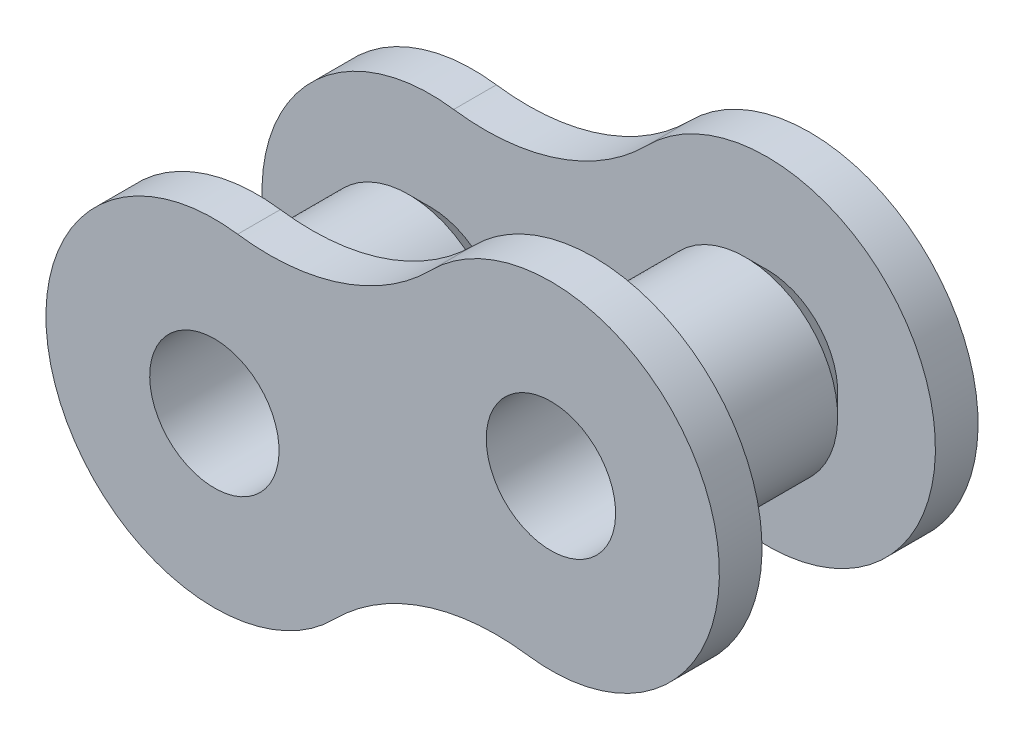
ISO-10303-21;
HEADER;
FILE_DESCRIPTION(('STEP AP214'),'2;1');
FILE_NAME('part.step','',(''),(''),'','','');
FILE_SCHEMA(('AUTOMOTIVE_DESIGN { 1 0 10303 214 1 1 1 1 }'));
ENDSEC;
DATA;
#1=APPLICATION_CONTEXT('core data for automotive mechanical design processes');
#2=APPLICATION_PROTOCOL_DEFINITION('international standard','automotive_design',2000,#1);
#3=PRODUCT_CONTEXT('',#1,'mechanical');
#4=PRODUCT('Part','Part','',(#3));
#5=PRODUCT_RELATED_PRODUCT_CATEGORY('part','',(#4));
#6=PRODUCT_DEFINITION_FORMATION('','',#4);
#7=PRODUCT_DEFINITION_CONTEXT('part definition',#1,'design');
#8=PRODUCT_DEFINITION('design','',#6,#7);
#9=PRODUCT_DEFINITION_SHAPE('','',#8);
#10=(LENGTH_UNIT() NAMED_UNIT(*) SI_UNIT(.MILLI.,.METRE.));
#11=(NAMED_UNIT(*) PLANE_ANGLE_UNIT() SI_UNIT($,.RADIAN.));
#12=(NAMED_UNIT(*) SI_UNIT($,.STERADIAN.) SOLID_ANGLE_UNIT());
#13=UNCERTAINTY_MEASURE_WITH_UNIT(LENGTH_MEASURE(1.E-05),#10,'distance_accuracy_value','');
#14=(GEOMETRIC_REPRESENTATION_CONTEXT(3) GLOBAL_UNCERTAINTY_ASSIGNED_CONTEXT((#13)) GLOBAL_UNIT_ASSIGNED_CONTEXT((#10,
#11,#12)) REPRESENTATION_CONTEXT('',''));
#15=CARTESIAN_POINT('',(0.,0.,0.));
#16=DIRECTION('',(0.,0.,1.));
#17=DIRECTION('',(1.,0.,0.));
#18=AXIS2_PLACEMENT_3D('',#15,#16,#17);
#19=CARTESIAN_POINT('',(99.9414403194544,925.337857612796,-128.5494));
#20=DIRECTION('',(0.,0.,-1.));
#21=DIRECTION('',(0.,-1.,0.));
#22=AXIS2_PLACEMENT_3D('',#19,#20,#21);
#23=PLANE('',#22);
#24=CARTESIAN_POINT('',(96.9343780588444,924.318935848962,-128.5494));
#25=DIRECTION('',(0.,0.,1.));
#26=DIRECTION('',(0.94710622381415,0.320920240577783,0.));
#27=AXIS2_PLACEMENT_3D('',#24,#25,#26);
#28=CIRCLE('',#27,3.0099);
#29=CARTESIAN_POINT('',(97.3505494962816,927.299925507558,-128.5494));
#30=VERTEX_POINT('',#29);
#31=CARTESIAN_POINT('',(99.0769437949649,922.204956171575,-128.5494));
#32=VERTEX_POINT('',#31);
#33=EDGE_CURVE('E230',#30,#32,#28,.T.);
#34=ORIENTED_EDGE('',*,*,#33,.T.);
#35=CARTESIAN_POINT('',(101.970322064774,919.350181282641,-128.5494));
#36=DIRECTION('',(0.,0.,1.));
#37=DIRECTION('',(0.94710622381415,0.320920240577783,0.));
#38=AXIS2_PLACEMENT_3D('',#35,#36,#37);
#39=CIRCLE('',#38,4.06464973628698);
#40=CARTESIAN_POINT('',(102.532331142627,923.375789718034,-128.5494));
#41=VERTEX_POINT('',#40);
#42=EDGE_CURVE('E203',#41,#32,#39,.T.);
#43=ORIENTED_EDGE('',*,*,#42,.F.);
#44=CARTESIAN_POINT('',(102.948502580064,926.356779376631,-128.5494));
#45=DIRECTION('',(0.,0.,1.));
#46=DIRECTION('',(0.94710622381415,0.320920240577783,0.));
#47=AXIS2_PLACEMENT_3D('',#44,#45,#46);
#48=CIRCLE('',#47,3.0099);
#49=CARTESIAN_POINT('',(100.805936843944,928.470759054017,-128.5494));
#50=VERTEX_POINT('',#49);
#51=EDGE_CURVE('E242',#41,#50,#48,.T.);
#52=ORIENTED_EDGE('',*,*,#51,.T.);
#53=CARTESIAN_POINT('',(97.9125585741344,931.325533942952,-128.5494));
#54=DIRECTION('',(0.,0.,1.));
#55=DIRECTION('',(0.94710622381415,0.320920240577783,0.));
#56=AXIS2_PLACEMENT_3D('',#53,#54,#55);
#57=CIRCLE('',#56,4.06464973628691);
#58=EDGE_CURVE('E20',#30,#50,#57,.T.);
#59=ORIENTED_EDGE('',*,*,#58,.F.);
#60=EDGE_LOOP('',(#34,#43,#52,#59));
#61=FACE_BOUND('',#60,.T.);
#62=CARTESIAN_POINT('',(102.948502580064,926.356779376631,-128.5494));
#63=DIRECTION('',(0.,0.,1.));
#64=DIRECTION('',(0.94710622381415,0.320920240577783,0.));
#65=AXIS2_PLACEMENT_3D('',#62,#63,#64);
#66=CIRCLE('',#65,1.26365);
#67=CARTESIAN_POINT('',(104.145313359787,926.762310238637,-128.5494));
#68=VERTEX_POINT('',#67);
#69=EDGE_CURVE('E227',#68,#68,#66,.T.);
#70=ORIENTED_EDGE('',*,*,#69,.F.);
#71=EDGE_LOOP('',(#70));
#72=FACE_BOUND('',#71,.T.);
#73=CARTESIAN_POINT('',(96.9343780588444,924.318935848962,-128.5494));
#74=DIRECTION('',(0.,0.,1.));
#75=DIRECTION('',(0.94710622381415,0.320920240577783,0.));
#76=AXIS2_PLACEMENT_3D('',#73,#74,#75);
#77=CIRCLE('',#76,1.26365);
#78=CARTESIAN_POINT('',(98.1311888385672,924.724466710968,-128.5494));
#79=VERTEX_POINT('',#78);
#80=EDGE_CURVE('E224',#79,#79,#77,.T.);
#81=ORIENTED_EDGE('',*,*,#80,.F.);
#82=EDGE_LOOP('',(#81));
#83=FACE_BOUND('',#82,.T.);
#84=ADVANCED_FACE('F17',(#61,#72,#83),#23,.F.);
#85=CARTESIAN_POINT('',(99.9414403194544,925.337857612796,-129.3114));
#86=DIRECTION('',(0.,0.,-1.));
#87=DIRECTION('',(0.,-1.,0.));
#88=AXIS2_PLACEMENT_3D('',#85,#86,#87);
#89=PLANE('',#88);
#90=CARTESIAN_POINT('',(96.9343780588444,924.318935848962,-129.3114));
#91=DIRECTION('',(0.,0.,1.));
#92=DIRECTION('',(0.94710622381415,0.320920240577783,0.));
#93=AXIS2_PLACEMENT_3D('',#90,#91,#92);
#94=CIRCLE('',#93,1.1557);
#95=CARTESIAN_POINT('',(98.0289487217064,924.689823370998,-129.3114));
#96=VERTEX_POINT('',#95);
#97=EDGE_CURVE('E587',#96,#96,#94,.T.);
#98=ORIENTED_EDGE('',*,*,#97,.T.);
#99=EDGE_LOOP('',(#98));
#100=FACE_BOUND('',#99,.T.);
#101=CARTESIAN_POINT('',(102.948502580064,926.356779376631,-129.3114));
#102=DIRECTION('',(0.,0.,1.));
#103=DIRECTION('',(0.94710622381415,0.320920240577783,0.));
#104=AXIS2_PLACEMENT_3D('',#101,#102,#103);
#105=CIRCLE('',#104,1.1557);
#106=CARTESIAN_POINT('',(104.043073242926,926.727666898667,-129.3114));
#107=VERTEX_POINT('',#106);
#108=EDGE_CURVE('E193',#107,#107,#105,.T.);
#109=ORIENTED_EDGE('',*,*,#108,.T.);
#110=EDGE_LOOP('',(#109));
#111=FACE_BOUND('',#110,.T.);
#112=CARTESIAN_POINT('',(96.9343780588444,924.318935848962,-129.3114));
#113=DIRECTION('',(0.,0.,1.));
#114=DIRECTION('',(0.94710622381415,0.320920240577783,0.));
#115=AXIS2_PLACEMENT_3D('',#112,#113,#114);
#116=CIRCLE('',#115,3.0099);
#117=CARTESIAN_POINT('',(97.3505494962816,927.299925507558,-129.3114));
#118=VERTEX_POINT('',#117);
#119=CARTESIAN_POINT('',(99.0769437949649,922.204956171575,-129.3114));
#120=VERTEX_POINT('',#119);
#121=EDGE_CURVE('E237',#118,#120,#116,.T.);
#122=ORIENTED_EDGE('',*,*,#121,.F.);
#123=CARTESIAN_POINT('',(97.9125585741344,931.325533942952,-129.3114));
#124=DIRECTION('',(0.,0.,1.));
#125=DIRECTION('',(0.94710622381415,0.320920240577783,0.));
#126=AXIS2_PLACEMENT_3D('',#123,#124,#125);
#127=CIRCLE('',#126,4.06464973628691);
#128=CARTESIAN_POINT('',(100.805936843944,928.470759054017,-129.3114));
#129=VERTEX_POINT('',#128);
#130=EDGE_CURVE('E11',#118,#129,#127,.T.);
#131=ORIENTED_EDGE('',*,*,#130,.T.);
#132=CARTESIAN_POINT('',(102.948502580064,926.356779376631,-129.3114));
#133=DIRECTION('',(0.,0.,1.));
#134=DIRECTION('',(0.94710622381415,0.320920240577783,0.));
#135=AXIS2_PLACEMENT_3D('',#132,#133,#134);
#136=CIRCLE('',#135,3.0099);
#137=CARTESIAN_POINT('',(102.532331142627,923.375789718034,-129.3114));
#138=VERTEX_POINT('',#137);
#139=EDGE_CURVE('E254',#138,#129,#136,.T.);
#140=ORIENTED_EDGE('',*,*,#139,.F.);
#141=CARTESIAN_POINT('',(101.970322064774,919.350181282641,-129.3114));
#142=DIRECTION('',(0.,0.,1.));
#143=DIRECTION('',(0.94710622381415,0.320920240577783,0.));
#144=AXIS2_PLACEMENT_3D('',#141,#142,#143);
#145=CIRCLE('',#144,4.06464973628698);
#146=EDGE_CURVE('E205',#138,#120,#145,.T.);
#147=ORIENTED_EDGE('',*,*,#146,.T.);
#148=EDGE_LOOP('',(#122,#131,#140,#147));
#149=FACE_BOUND('',#148,.T.);
#150=ADVANCED_FACE('F426',(#100,#111,#149),#89,.T.);
#151=CARTESIAN_POINT('',(97.9125585741344,931.325533942952,-129.3114));
#152=DIRECTION('',(0.,0.,1.));
#153=DIRECTION('',(-0.94710622381415,-0.320920240577783,0.));
#154=AXIS2_PLACEMENT_3D('',#151,#152,#153);
#155=CYLINDRICAL_SURFACE('',#154,4.06464973628691);
#156=ORIENTED_EDGE('',*,*,#58,.T.);
#157=DIRECTION('',(0.,0.,1.));
#158=VECTOR('',#157,1.);
#159=CARTESIAN_POINT('',(100.805936843944,928.470759054017,-129.3114));
#160=LINE('',#159,#158);
#161=EDGE_CURVE('E257',#129,#50,#160,.T.);
#162=ORIENTED_EDGE('',*,*,#161,.F.);
#163=ORIENTED_EDGE('',*,*,#130,.F.);
#164=DIRECTION('',(0.,0.,1.));
#165=VECTOR('',#164,1.);
#166=CARTESIAN_POINT('',(97.3505494962816,927.299925507558,-129.3114));
#167=LINE('',#166,#165);
#168=EDGE_CURVE('E234',#118,#30,#167,.T.);
#169=ORIENTED_EDGE('',*,*,#168,.T.);
#170=EDGE_LOOP('',(#156,#162,#163,#169));
#171=FACE_BOUND('',#170,.T.);
#172=ADVANCED_FACE('F418',(#171),#155,.F.);
#173=CARTESIAN_POINT('',(102.948502580064,926.356779376631,-129.3114));
#174=DIRECTION('',(0.,0.,1.));
#175=DIRECTION('',(-0.94710622381415,-0.320920240577783,0.));
#176=AXIS2_PLACEMENT_3D('',#173,#174,#175);
#177=CYLINDRICAL_SURFACE('',#176,3.0099);
#178=ORIENTED_EDGE('',*,*,#51,.F.);
#179=DIRECTION('',(0.,0.,1.));
#180=VECTOR('',#179,1.);
#181=CARTESIAN_POINT('',(102.532331142627,923.375789718034,-129.3114));
#182=LINE('',#181,#180);
#183=EDGE_CURVE('E238',#138,#41,#182,.T.);
#184=ORIENTED_EDGE('',*,*,#183,.F.);
#185=ORIENTED_EDGE('',*,*,#139,.T.);
#186=ORIENTED_EDGE('',*,*,#161,.T.);
#187=EDGE_LOOP('',(#178,#184,#185,#186));
#188=FACE_BOUND('',#187,.T.);
#189=ADVANCED_FACE('F352',(#188),#177,.T.);
#190=CARTESIAN_POINT('',(101.970322064774,919.350181282641,-129.3114));
#191=DIRECTION('',(0.,0.,1.));
#192=DIRECTION('',(-0.94710622381415,-0.320920240577783,0.));
#193=AXIS2_PLACEMENT_3D('',#190,#191,#192);
#194=CYLINDRICAL_SURFACE('',#193,4.06464973628698);
#195=ORIENTED_EDGE('',*,*,#42,.T.);
#196=DIRECTION('',(0.,0.,1.));
#197=VECTOR('',#196,1.);
#198=CARTESIAN_POINT('',(99.0769437949649,922.204956171575,-129.3114));
#199=LINE('',#198,#197);
#200=EDGE_CURVE('E206',#120,#32,#199,.T.);
#201=ORIENTED_EDGE('',*,*,#200,.F.);
#202=ORIENTED_EDGE('',*,*,#146,.F.);
#203=ORIENTED_EDGE('',*,*,#183,.T.);
#204=EDGE_LOOP('',(#195,#201,#202,#203));
#205=FACE_BOUND('',#204,.T.);
#206=ADVANCED_FACE('F346',(#205),#194,.F.);
#207=CARTESIAN_POINT('',(96.9343780588444,924.318935848962,-129.3114));
#208=DIRECTION('',(0.,0.,1.));
#209=DIRECTION('',(-0.94710622381415,-0.320920240577783,0.));
#210=AXIS2_PLACEMENT_3D('',#207,#208,#209);
#211=CYLINDRICAL_SURFACE('',#210,3.0099);
#212=ORIENTED_EDGE('',*,*,#33,.F.);
#213=ORIENTED_EDGE('',*,*,#168,.F.);
#214=ORIENTED_EDGE('',*,*,#121,.T.);
#215=ORIENTED_EDGE('',*,*,#200,.T.);
#216=EDGE_LOOP('',(#212,#213,#214,#215));
#217=FACE_BOUND('',#216,.T.);
#218=ADVANCED_FACE('F351',(#217),#211,.T.);
#219=CARTESIAN_POINT('',(102.948502580064,926.356779376631,-128.5494));
#220=DIRECTION('',(0.,0.,1.));
#221=DIRECTION('',(-0.94710622381415,-0.320920240577783,0.));
#222=AXIS2_PLACEMENT_3D('',#219,#220,#221);
#223=CONICAL_SURFACE('',#222,1.26365,0.785398163397448);
#224=ORIENTED_EDGE('',*,*,#69,.T.);
#225=EDGE_LOOP('',(#224));
#226=FACE_BOUND('',#225,.T.);
#227=CARTESIAN_POINT('',(102.948502580064,926.356779376631,-128.16205));
#228=DIRECTION('',(0.,0.,-1.));
#229=DIRECTION('',(0.94710622381415,0.320920240577783,0.));
#230=AXIS2_PLACEMENT_3D('',#227,#228,#229);
#231=CIRCLE('',#230,1.651);
#232=CARTESIAN_POINT('',(104.512174955581,926.886618693825,-128.16205));
#233=VERTEX_POINT('',#232);
#234=EDGE_CURVE('E187',#233,#233,#231,.T.);
#235=ORIENTED_EDGE('',*,*,#234,.T.);
#236=EDGE_LOOP('',(#235));
#237=FACE_BOUND('',#236,.T.);
#238=ADVANCED_FACE('F369',(#226,#237),#223,.T.);
#239=CARTESIAN_POINT('',(96.9343780588444,924.318935848962,-128.5494));
#240=DIRECTION('',(0.,0.,1.));
#241=DIRECTION('',(-0.94710622381415,-0.320920240577783,0.));
#242=AXIS2_PLACEMENT_3D('',#239,#240,#241);
#243=CONICAL_SURFACE('',#242,1.26365,0.785398163397448);
#244=ORIENTED_EDGE('',*,*,#80,.T.);
#245=EDGE_LOOP('',(#244));
#246=FACE_BOUND('',#245,.T.);
#247=CARTESIAN_POINT('',(96.9343780588444,924.318935848962,-128.16205));
#248=DIRECTION('',(0.,0.,-1.));
#249=DIRECTION('',(0.94710622381415,0.320920240577783,0.));
#250=AXIS2_PLACEMENT_3D('',#247,#248,#249);
#251=CIRCLE('',#250,1.651);
#252=CARTESIAN_POINT('',(98.4980504343616,924.848775166156,-128.16205));
#253=VERTEX_POINT('',#252);
#254=EDGE_CURVE('E579',#253,#253,#251,.T.);
#255=ORIENTED_EDGE('',*,*,#254,.T.);
#256=EDGE_LOOP('',(#255));
#257=FACE_BOUND('',#256,.T.);
#258=ADVANCED_FACE('F394',(#246,#257),#243,.T.);
#259=CARTESIAN_POINT('',(99.9414403194544,925.337857612796,-125.4506));
#260=DIRECTION('',(0.,0.,1.));
#261=DIRECTION('',(1.,0.,0.));
#262=AXIS2_PLACEMENT_3D('',#259,#260,#261);
#263=PLANE('',#262);
#264=CARTESIAN_POINT('',(96.9343780588444,924.318935848962,-125.4506));
#265=DIRECTION('',(0.,0.,1.));
#266=DIRECTION('',(0.94710622381415,0.320920240577783,0.));
#267=AXIS2_PLACEMENT_3D('',#264,#265,#266);
#268=CIRCLE('',#267,3.0099);
#269=CARTESIAN_POINT('',(97.3505494962816,927.299925507558,-125.4506));
#270=VERTEX_POINT('',#269);
#271=CARTESIAN_POINT('',(99.0769437949649,922.204956171575,-125.4506));
#272=VERTEX_POINT('',#271);
#273=EDGE_CURVE('E168',#270,#272,#268,.T.);
#274=ORIENTED_EDGE('',*,*,#273,.F.);
#275=CARTESIAN_POINT('',(97.9125585741344,931.325533942952,-125.4506));
#276=DIRECTION('',(0.,0.,1.));
#277=DIRECTION('',(0.94710622381415,0.320920240577783,0.));
#278=AXIS2_PLACEMENT_3D('',#275,#276,#277);
#279=CIRCLE('',#278,4.06464973628691);
#280=CARTESIAN_POINT('',(100.805936843944,928.470759054017,-125.4506));
#281=VERTEX_POINT('',#280);
#282=EDGE_CURVE('E150',#270,#281,#279,.T.);
#283=ORIENTED_EDGE('',*,*,#282,.T.);
#284=CARTESIAN_POINT('',(102.948502580064,926.356779376631,-125.4506));
#285=DIRECTION('',(0.,0.,1.));
#286=DIRECTION('',(0.94710622381415,0.320920240577783,0.));
#287=AXIS2_PLACEMENT_3D('',#284,#285,#286);
#288=CIRCLE('',#287,3.0099);
#289=CARTESIAN_POINT('',(102.532331142627,923.375789718034,-125.4506));
#290=VERTEX_POINT('',#289);
#291=EDGE_CURVE('E197',#290,#281,#288,.T.);
#292=ORIENTED_EDGE('',*,*,#291,.F.);
#293=CARTESIAN_POINT('',(101.970322064774,919.350181282641,-125.4506));
#294=DIRECTION('',(0.,0.,1.));
#295=DIRECTION('',(0.94710622381415,0.320920240577783,0.));
#296=AXIS2_PLACEMENT_3D('',#293,#294,#295);
#297=CIRCLE('',#296,4.06464973628698);
#298=EDGE_CURVE('E172',#290,#272,#297,.T.);
#299=ORIENTED_EDGE('',*,*,#298,.T.);
#300=EDGE_LOOP('',(#274,#283,#292,#299));
#301=FACE_BOUND('',#300,.T.);
#302=CARTESIAN_POINT('',(102.948502580064,926.356779376631,-125.4506));
#303=DIRECTION('',(0.,0.,1.));
#304=DIRECTION('',(0.94710622381415,0.320920240577783,0.));
#305=AXIS2_PLACEMENT_3D('',#302,#303,#304);
#306=CIRCLE('',#305,1.26365);
#307=CARTESIAN_POINT('',(104.145313359787,926.762310238637,-125.4506));
#308=VERTEX_POINT('',#307);
#309=EDGE_CURVE('E180',#308,#308,#306,.T.);
#310=ORIENTED_EDGE('',*,*,#309,.T.);
#311=EDGE_LOOP('',(#310));
#312=FACE_BOUND('',#311,.T.);
#313=CARTESIAN_POINT('',(96.9343780588444,924.318935848962,-125.4506));
#314=DIRECTION('',(0.,0.,1.));
#315=DIRECTION('',(0.94710622381415,0.320920240577783,0.));
#316=AXIS2_PLACEMENT_3D('',#313,#314,#315);
#317=CIRCLE('',#316,1.26365);
#318=CARTESIAN_POINT('',(98.1311888385672,924.724466710968,-125.4506));
#319=VERTEX_POINT('',#318);
#320=EDGE_CURVE('E194',#319,#319,#317,.T.);
#321=ORIENTED_EDGE('',*,*,#320,.T.);
#322=EDGE_LOOP('',(#321));
#323=FACE_BOUND('',#322,.T.);
#324=ADVANCED_FACE('F174',(#301,#312,#323),#263,.F.);
#325=CARTESIAN_POINT('',(99.9414403194544,925.337857612796,-124.6886));
#326=DIRECTION('',(0.,0.,1.));
#327=DIRECTION('',(1.,0.,0.));
#328=AXIS2_PLACEMENT_3D('',#325,#326,#327);
#329=PLANE('',#328);
#330=CARTESIAN_POINT('',(96.9343780588444,924.318935848962,-124.6886));
#331=DIRECTION('',(0.,0.,1.));
#332=DIRECTION('',(0.94710622381415,0.320920240577783,0.));
#333=AXIS2_PLACEMENT_3D('',#330,#331,#332);
#334=CIRCLE('',#333,1.1557);
#335=CARTESIAN_POINT('',(98.0289487217064,924.689823370998,-124.6886));
#336=VERTEX_POINT('',#335);
#337=EDGE_CURVE('E603',#336,#336,#334,.T.);
#338=ORIENTED_EDGE('',*,*,#337,.F.);
#339=EDGE_LOOP('',(#338));
#340=FACE_BOUND('',#339,.T.);
#341=CARTESIAN_POINT('',(102.948502580064,926.356779376631,-124.6886));
#342=DIRECTION('',(0.,0.,1.));
#343=DIRECTION('',(0.94710622381415,0.320920240577783,0.));
#344=AXIS2_PLACEMENT_3D('',#341,#342,#343);
#345=CIRCLE('',#344,1.1557);
#346=CARTESIAN_POINT('',(104.043073242926,926.727666898667,-124.6886));
#347=VERTEX_POINT('',#346);
#348=EDGE_CURVE('E191',#347,#347,#345,.T.);
#349=ORIENTED_EDGE('',*,*,#348,.F.);
#350=EDGE_LOOP('',(#349));
#351=FACE_BOUND('',#350,.T.);
#352=CARTESIAN_POINT('',(96.9343780588444,924.318935848962,-124.6886));
#353=DIRECTION('',(0.,0.,1.));
#354=DIRECTION('',(0.94710622381415,0.320920240577783,0.));
#355=AXIS2_PLACEMENT_3D('',#352,#353,#354);
#356=CIRCLE('',#355,3.0099);
#357=CARTESIAN_POINT('',(97.3505494962816,927.299925507558,-124.6886));
#358=VERTEX_POINT('',#357);
#359=CARTESIAN_POINT('',(99.0769437949649,922.204956171575,-124.6886));
#360=VERTEX_POINT('',#359);
#361=EDGE_CURVE('E170',#358,#360,#356,.T.);
#362=ORIENTED_EDGE('',*,*,#361,.T.);
#363=CARTESIAN_POINT('',(101.970322064774,919.350181282641,-124.6886));
#364=DIRECTION('',(0.,0.,1.));
#365=DIRECTION('',(0.94710622381415,0.320920240577783,0.));
#366=AXIS2_PLACEMENT_3D('',#363,#364,#365);
#367=CIRCLE('',#366,4.06464973628698);
#368=CARTESIAN_POINT('',(102.532331142627,923.375789718034,-124.6886));
#369=VERTEX_POINT('',#368);
#370=EDGE_CURVE('E214',#369,#360,#367,.T.);
#371=ORIENTED_EDGE('',*,*,#370,.F.);
#372=CARTESIAN_POINT('',(102.948502580064,926.356779376631,-124.6886));
#373=DIRECTION('',(0.,0.,1.));
#374=DIRECTION('',(0.94710622381415,0.320920240577783,0.));
#375=AXIS2_PLACEMENT_3D('',#372,#373,#374);
#376=CIRCLE('',#375,3.0099);
#377=CARTESIAN_POINT('',(100.805936843944,928.470759054017,-124.6886));
#378=VERTEX_POINT('',#377);
#379=EDGE_CURVE('E162',#369,#378,#376,.T.);
#380=ORIENTED_EDGE('',*,*,#379,.T.);
#381=CARTESIAN_POINT('',(97.9125585741344,931.325533942952,-124.6886));
#382=DIRECTION('',(0.,0.,1.));
#383=DIRECTION('',(0.94710622381415,0.320920240577783,0.));
#384=AXIS2_PLACEMENT_3D('',#381,#382,#383);
#385=CIRCLE('',#384,4.06464973628691);
#386=EDGE_CURVE('E161',#358,#378,#385,.T.);
#387=ORIENTED_EDGE('',*,*,#386,.F.);
#388=EDGE_LOOP('',(#362,#371,#380,#387));
#389=FACE_BOUND('',#388,.T.);
#390=ADVANCED_FACE('F378',(#340,#351,#389),#329,.T.);
#391=CARTESIAN_POINT('',(97.9125585741344,931.325533942952,-124.6886));
#392=DIRECTION('',(0.,0.,-1.));
#393=DIRECTION('',(-0.94710622381415,-0.320920240577783,0.));
#394=AXIS2_PLACEMENT_3D('',#391,#392,#393);
#395=CYLINDRICAL_SURFACE('',#394,4.06464973628691);
#396=ORIENTED_EDGE('',*,*,#282,.F.);
#397=DIRECTION('',(0.,0.,-1.));
#398=VECTOR('',#397,1.);
#399=CARTESIAN_POINT('',(97.3505494962816,927.299925507558,-124.6886));
#400=LINE('',#399,#398);
#401=EDGE_CURVE('E153',#358,#270,#400,.T.);
#402=ORIENTED_EDGE('',*,*,#401,.F.);
#403=ORIENTED_EDGE('',*,*,#386,.T.);
#404=DIRECTION('',(0.,0.,-1.));
#405=VECTOR('',#404,1.);
#406=CARTESIAN_POINT('',(100.805936843944,928.470759054017,-124.6886));
#407=LINE('',#406,#405);
#408=EDGE_CURVE('E156',#378,#281,#407,.T.);
#409=ORIENTED_EDGE('',*,*,#408,.T.);
#410=EDGE_LOOP('',(#396,#402,#403,#409));
#411=FACE_BOUND('',#410,.T.);
#412=ADVANCED_FACE('F152',(#411),#395,.F.);
#413=CARTESIAN_POINT('',(102.948502580064,926.356779376631,-124.6886));
#414=DIRECTION('',(0.,0.,-1.));
#415=DIRECTION('',(-0.94710622381415,-0.320920240577783,0.));
#416=AXIS2_PLACEMENT_3D('',#413,#414,#415);
#417=CYLINDRICAL_SURFACE('',#416,3.0099);
#418=ORIENTED_EDGE('',*,*,#291,.T.);
#419=ORIENTED_EDGE('',*,*,#408,.F.);
#420=ORIENTED_EDGE('',*,*,#379,.F.);
#421=DIRECTION('',(0.,0.,-1.));
#422=VECTOR('',#421,1.);
#423=CARTESIAN_POINT('',(102.532331142627,923.375789718034,-124.6886));
#424=LINE('',#423,#422);
#425=EDGE_CURVE('E210',#369,#290,#424,.T.);
#426=ORIENTED_EDGE('',*,*,#425,.T.);
#427=EDGE_LOOP('',(#418,#419,#420,#426));
#428=FACE_BOUND('',#427,.T.);
#429=ADVANCED_FACE('F336',(#428),#417,.T.);
#430=CARTESIAN_POINT('',(101.970322064774,919.350181282641,-124.6886));
#431=DIRECTION('',(0.,0.,-1.));
#432=DIRECTION('',(-0.94710622381415,-0.320920240577783,0.));
#433=AXIS2_PLACEMENT_3D('',#430,#431,#432);
#434=CYLINDRICAL_SURFACE('',#433,4.06464973628698);
#435=ORIENTED_EDGE('',*,*,#298,.F.);
#436=ORIENTED_EDGE('',*,*,#425,.F.);
#437=ORIENTED_EDGE('',*,*,#370,.T.);
#438=DIRECTION('',(0.,0.,-1.));
#439=VECTOR('',#438,1.);
#440=CARTESIAN_POINT('',(99.0769437949649,922.204956171575,-124.6886));
#441=LINE('',#440,#439);
#442=EDGE_CURVE('E179',#360,#272,#441,.T.);
#443=ORIENTED_EDGE('',*,*,#442,.T.);
#444=EDGE_LOOP('',(#435,#436,#437,#443));
#445=FACE_BOUND('',#444,.T.);
#446=ADVANCED_FACE('F271',(#445),#434,.F.);
#447=CARTESIAN_POINT('',(96.9343780588444,924.318935848962,-124.6886));
#448=DIRECTION('',(0.,0.,-1.));
#449=DIRECTION('',(-0.94710622381415,-0.320920240577783,0.));
#450=AXIS2_PLACEMENT_3D('',#447,#448,#449);
#451=CYLINDRICAL_SURFACE('',#450,3.0099);
#452=ORIENTED_EDGE('',*,*,#273,.T.);
#453=ORIENTED_EDGE('',*,*,#442,.F.);
#454=ORIENTED_EDGE('',*,*,#361,.F.);
#455=ORIENTED_EDGE('',*,*,#401,.T.);
#456=EDGE_LOOP('',(#452,#453,#454,#455));
#457=FACE_BOUND('',#456,.T.);
#458=ADVANCED_FACE('F166',(#457),#451,.T.);
#459=CARTESIAN_POINT('',(102.948502580064,926.356779376631,-125.4506));
#460=DIRECTION('',(0.,0.,-1.));
#461=DIRECTION('',(-0.94710622381415,-0.320920240577783,0.));
#462=AXIS2_PLACEMENT_3D('',#459,#460,#461);
#463=CONICAL_SURFACE('',#462,1.26365,0.785398163397448);
#464=ORIENTED_EDGE('',*,*,#309,.F.);
#465=EDGE_LOOP('',(#464));
#466=FACE_BOUND('',#465,.T.);
#467=CARTESIAN_POINT('',(102.948502580064,926.356779376631,-125.83795));
#468=DIRECTION('',(0.,0.,-1.));
#469=DIRECTION('',(0.94710622381415,0.320920240577783,0.));
#470=AXIS2_PLACEMENT_3D('',#467,#468,#469);
#471=CIRCLE('',#470,1.651);
#472=CARTESIAN_POINT('',(104.512174955581,926.886618693825,-125.83795));
#473=VERTEX_POINT('',#472);
#474=EDGE_CURVE('E200',#473,#473,#471,.T.);
#475=ORIENTED_EDGE('',*,*,#474,.F.);
#476=EDGE_LOOP('',(#475));
#477=FACE_BOUND('',#476,.T.);
#478=ADVANCED_FACE('F270',(#466,#477),#463,.T.);
#479=CARTESIAN_POINT('',(102.948502580064,926.356779376631,-125.4506));
#480=DIRECTION('',(0.,0.,-1.));
#481=DIRECTION('',(-0.94710622381415,-0.320920240577783,0.));
#482=AXIS2_PLACEMENT_3D('',#479,#480,#481);
#483=CYLINDRICAL_SURFACE('',#482,1.651);
#484=ORIENTED_EDGE('',*,*,#234,.F.);
#485=EDGE_LOOP('',(#484));
#486=FACE_BOUND('',#485,.T.);
#487=ORIENTED_EDGE('',*,*,#474,.T.);
#488=EDGE_LOOP('',(#487));
#489=FACE_BOUND('',#488,.T.);
#490=ADVANCED_FACE('F305',(#486,#489),#483,.T.);
#491=CARTESIAN_POINT('',(102.948502580064,926.356779376631,-125.4506));
#492=DIRECTION('',(0.,0.,-1.));
#493=DIRECTION('',(-0.94710622381415,-0.320920240577783,0.));
#494=AXIS2_PLACEMENT_3D('',#491,#492,#493);
#495=CYLINDRICAL_SURFACE('',#494,1.1557);
#496=ORIENTED_EDGE('',*,*,#108,.F.);
#497=EDGE_LOOP('',(#496));
#498=FACE_BOUND('',#497,.T.);
#499=ORIENTED_EDGE('',*,*,#348,.T.);
#500=EDGE_LOOP('',(#499));
#501=FACE_BOUND('',#500,.T.);
#502=ADVANCED_FACE('F284',(#498,#501),#495,.F.);
#503=CARTESIAN_POINT('',(96.9343780588444,924.318935848962,-125.4506));
#504=DIRECTION('',(0.,0.,-1.));
#505=DIRECTION('',(-0.94710622381415,-0.320920240577783,0.));
#506=AXIS2_PLACEMENT_3D('',#503,#504,#505);
#507=CONICAL_SURFACE('',#506,1.26365,0.785398163397448);
#508=ORIENTED_EDGE('',*,*,#320,.F.);
#509=EDGE_LOOP('',(#508));
#510=FACE_BOUND('',#509,.T.);
#511=CARTESIAN_POINT('',(96.9343780588444,924.318935848962,-125.83795));
#512=DIRECTION('',(0.,0.,-1.));
#513=DIRECTION('',(0.94710622381415,0.320920240577783,0.));
#514=AXIS2_PLACEMENT_3D('',#511,#512,#513);
#515=CIRCLE('',#514,1.651);
#516=CARTESIAN_POINT('',(98.4980504343616,924.848775166156,-125.83795));
#517=VERTEX_POINT('',#516);
#518=EDGE_CURVE('E581',#517,#517,#515,.T.);
#519=ORIENTED_EDGE('',*,*,#518,.F.);
#520=EDGE_LOOP('',(#519));
#521=FACE_BOUND('',#520,.T.);
#522=ADVANCED_FACE('F278',(#510,#521),#507,.T.);
#523=CARTESIAN_POINT('',(96.9343780588444,924.318935848962,-125.4506));
#524=DIRECTION('',(0.,0.,-1.));
#525=DIRECTION('',(-0.94710622381415,-0.320920240577783,0.));
#526=AXIS2_PLACEMENT_3D('',#523,#524,#525);
#527=CYLINDRICAL_SURFACE('',#526,1.651);
#528=ORIENTED_EDGE('',*,*,#254,.F.);
#529=EDGE_LOOP('',(#528));
#530=FACE_BOUND('',#529,.T.);
#531=ORIENTED_EDGE('',*,*,#518,.T.);
#532=EDGE_LOOP('',(#531));
#533=FACE_BOUND('',#532,.T.);
#534=ADVANCED_FACE('F283',(#530,#533),#527,.T.);
#535=CARTESIAN_POINT('',(96.9343780588444,924.318935848962,-125.4506));
#536=DIRECTION('',(0.,0.,-1.));
#537=DIRECTION('',(-0.94710622381415,-0.320920240577783,0.));
#538=AXIS2_PLACEMENT_3D('',#535,#536,#537);
#539=CYLINDRICAL_SURFACE('',#538,1.1557);
#540=ORIENTED_EDGE('',*,*,#97,.F.);
#541=EDGE_LOOP('',(#540));
#542=FACE_BOUND('',#541,.T.);
#543=ORIENTED_EDGE('',*,*,#337,.T.);
#544=EDGE_LOOP('',(#543));
#545=FACE_BOUND('',#544,.T.);
#546=ADVANCED_FACE('F292',(#542,#545),#539,.F.);
#547=CLOSED_SHELL('',(#84,#150,#172,#189,#206,#218,#238,#258,#324,#390,#412,#429,#446,#458,#478,
#490,#502,#522,#534,#546));
#548=MANIFOLD_SOLID_BREP('B1',#547);
#549=ADVANCED_BREP_SHAPE_REPRESENTATION('',(#18,#548),#14);
#550=SHAPE_DEFINITION_REPRESENTATION(#9,#549);
ENDSEC;
END-ISO-10303-21;
